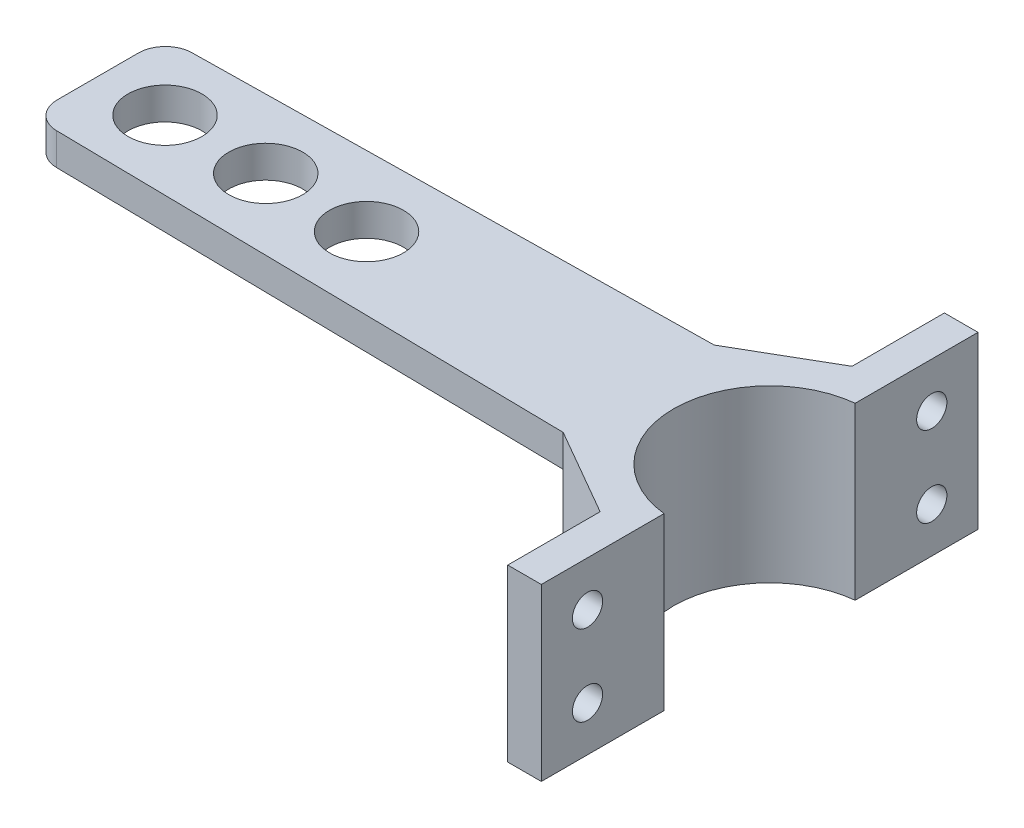
ISO-10303-21;
HEADER;
FILE_DESCRIPTION(('STEP AP214'),'2;1');
FILE_NAME('part.step','',(''),(''),'','','');
FILE_SCHEMA(('AUTOMOTIVE_DESIGN { 1 0 10303 214 1 1 1 1 }'));
ENDSEC;
DATA;
#1=APPLICATION_CONTEXT('core data for automotive mechanical design processes');
#2=APPLICATION_PROTOCOL_DEFINITION('international standard','automotive_design',2000,#1);
#3=PRODUCT_CONTEXT('',#1,'mechanical');
#4=PRODUCT('Part','Part','',(#3));
#5=PRODUCT_RELATED_PRODUCT_CATEGORY('part','',(#4));
#6=PRODUCT_DEFINITION_FORMATION('','',#4);
#7=PRODUCT_DEFINITION_CONTEXT('part definition',#1,'design');
#8=PRODUCT_DEFINITION('design','',#6,#7);
#9=PRODUCT_DEFINITION_SHAPE('','',#8);
#10=(LENGTH_UNIT() NAMED_UNIT(*) SI_UNIT(.MILLI.,.METRE.));
#11=(NAMED_UNIT(*) PLANE_ANGLE_UNIT() SI_UNIT($,.RADIAN.));
#12=(NAMED_UNIT(*) SI_UNIT($,.STERADIAN.) SOLID_ANGLE_UNIT());
#13=UNCERTAINTY_MEASURE_WITH_UNIT(LENGTH_MEASURE(1.E-05),#10,'distance_accuracy_value','');
#14=(GEOMETRIC_REPRESENTATION_CONTEXT(3) GLOBAL_UNCERTAINTY_ASSIGNED_CONTEXT((#13)) GLOBAL_UNIT_ASSIGNED_CONTEXT((#10,
#11,#12)) REPRESENTATION_CONTEXT('',''));
#15=CARTESIAN_POINT('',(0.,0.,0.));
#16=DIRECTION('',(0.,0.,1.));
#17=DIRECTION('',(1.,0.,0.));
#18=AXIS2_PLACEMENT_3D('',#15,#16,#17);
#19=CARTESIAN_POINT('',(-19.4855651735435,25.4,0.0158072005749479));
#20=DIRECTION('',(0.999999670956206,0.,-0.000811225911740494));
#21=DIRECTION('',(-0.000811225911740494,0.,-0.999999670956206));
#22=AXIS2_PLACEMENT_3D('',#19,#20,#21);
#23=PLANE('',#22);
#24=DIRECTION('',(0.000811225911740494,0.,0.999999670956206));
#25=VECTOR('',#24,1.);
#26=CARTESIAN_POINT('',(-19.4855651735435,20.6375,0.0158072005749479));
#27=LINE('',#26,#25);
#28=CARTESIAN_POINT('',(-19.4946914650506,20.6375,-11.2341890976824));
#29=VERTEX_POINT('',#28);
#30=CARTESIAN_POINT('',(-19.4764388820364,20.6375,11.2658034988322));
#31=VERTEX_POINT('',#30);
#32=EDGE_CURVE('E153',#29,#31,#27,.T.);
#33=ORIENTED_EDGE('',*,*,#32,.F.);
#34=DIRECTION('',(0.,-1.,0.));
#35=VECTOR('',#34,1.);
#36=CARTESIAN_POINT('',(-19.4946914650506,25.4,-11.2341890976824));
#37=LINE('',#36,#35);
#38=CARTESIAN_POINT('',(-19.4946914650506,0.,-11.2341890976824));
#39=VERTEX_POINT('',#38);
#40=EDGE_CURVE('E165',#29,#39,#37,.T.);
#41=ORIENTED_EDGE('',*,*,#40,.T.);
#42=DIRECTION('',(0.000811225911740494,0.,0.999999670956206));
#43=VECTOR('',#42,1.);
#44=CARTESIAN_POINT('',(-19.4855651735435,0.,0.0158072005749479));
#45=LINE('',#44,#43);
#46=CARTESIAN_POINT('',(-19.4764388820364,0.,11.2658034988323));
#47=VERTEX_POINT('',#46);
#48=EDGE_CURVE('E170',#39,#47,#45,.T.);
#49=ORIENTED_EDGE('',*,*,#48,.T.);
#50=DIRECTION('',(0.,-1.,0.));
#51=VECTOR('',#50,1.);
#52=CARTESIAN_POINT('',(-19.4764388820364,25.4,11.2658034988323));
#53=LINE('',#52,#51);
#54=EDGE_CURVE('E161',#31,#47,#53,.T.);
#55=ORIENTED_EDGE('',*,*,#54,.F.);
#56=EDGE_LOOP('',(#33,#41,#49,#55));
#57=FACE_BOUND('',#56,.T.);
#58=ADVANCED_FACE('F39',(#57),#23,.F.);
#59=CARTESIAN_POINT('',(0.,25.4,-32.5035075145393));
#60=DIRECTION('',(0.,0.,1.));
#61=DIRECTION('',(1.,0.,0.));
#62=AXIS2_PLACEMENT_3D('',#59,#60,#61);
#63=PLANE('',#62);
#64=DIRECTION('',(-1.,0.,0.));
#65=VECTOR('',#64,1.);
#66=CARTESIAN_POINT('',(0.,0.,-32.5035075145393));
#67=LINE('',#66,#65);
#68=CARTESIAN_POINT('',(-1.5,0.,-32.5035075145393));
#69=VERTEX_POINT('',#68);
#70=CARTESIAN_POINT('',(-6.5,0.,-32.5035075145393));
#71=VERTEX_POINT('',#70);
#72=EDGE_CURVE('E213',#69,#71,#67,.T.);
#73=ORIENTED_EDGE('',*,*,#72,.T.);
#74=DIRECTION('',(0.,-1.,0.));
#75=VECTOR('',#74,1.);
#76=CARTESIAN_POINT('',(-6.5,25.4,-32.5035075145393));
#77=LINE('',#76,#75);
#78=CARTESIAN_POINT('',(-6.5,25.4,-32.5035075145393));
#79=VERTEX_POINT('',#78);
#80=EDGE_CURVE('E286',#79,#71,#77,.T.);
#81=ORIENTED_EDGE('',*,*,#80,.F.);
#82=DIRECTION('',(-1.,0.,0.));
#83=VECTOR('',#82,1.);
#84=CARTESIAN_POINT('',(0.,25.4,-32.5035075145393));
#85=LINE('',#84,#83);
#86=CARTESIAN_POINT('',(-1.5,25.4,-32.5035075145393));
#87=VERTEX_POINT('',#86);
#88=EDGE_CURVE('E222',#87,#79,#85,.T.);
#89=ORIENTED_EDGE('',*,*,#88,.F.);
#90=DIRECTION('',(0.,-1.,0.));
#91=VECTOR('',#90,1.);
#92=CARTESIAN_POINT('',(-1.5,25.4,-32.5035075145393));
#93=LINE('',#92,#91);
#94=EDGE_CURVE('E245',#87,#69,#93,.T.);
#95=ORIENTED_EDGE('',*,*,#94,.T.);
#96=EDGE_LOOP('',(#73,#81,#89,#95));
#97=FACE_BOUND('',#96,.T.);
#98=ADVANCED_FACE('F349',(#97),#63,.F.);
#99=CARTESIAN_POINT('',(-6.5,25.4,0.));
#100=DIRECTION('',(1.,0.,0.));
#101=DIRECTION('',(0.,0.,-1.));
#102=AXIS2_PLACEMENT_3D('',#99,#100,#101);
#103=PLANE('',#102);
#104=CARTESIAN_POINT('',(-6.5,18.7,-25.620108633731));
#105=DIRECTION('',(1.,0.,0.));
#106=DIRECTION('',(0.,0.,-1.));
#107=AXIS2_PLACEMENT_3D('',#104,#105,#106);
#108=CIRCLE('',#107,2.25);
#109=CARTESIAN_POINT('',(-6.5,18.7,-27.870108633731));
#110=VERTEX_POINT('',#109);
#111=EDGE_CURVE('E202',#110,#110,#108,.T.);
#112=ORIENTED_EDGE('',*,*,#111,.T.);
#113=EDGE_LOOP('',(#112));
#114=FACE_BOUND('',#113,.T.);
#115=CARTESIAN_POINT('',(-6.5,6.7,-25.620108633731));
#116=DIRECTION('',(1.,0.,0.));
#117=DIRECTION('',(0.,0.,-1.));
#118=AXIS2_PLACEMENT_3D('',#115,#116,#117);
#119=CIRCLE('',#118,2.25);
#120=CARTESIAN_POINT('',(-6.5,6.7,-27.870108633731));
#121=VERTEX_POINT('',#120);
#122=EDGE_CURVE('E176',#121,#121,#119,.T.);
#123=ORIENTED_EDGE('',*,*,#122,.T.);
#124=EDGE_LOOP('',(#123));
#125=FACE_BOUND('',#124,.T.);
#126=DIRECTION('',(0.,0.,1.));
#127=VECTOR('',#126,1.);
#128=CARTESIAN_POINT('',(-6.5,0.,0.));
#129=LINE('',#128,#127);
#130=CARTESIAN_POINT('',(-6.5,0.,-18.7507398110798));
#131=VERTEX_POINT('',#130);
#132=EDGE_CURVE('E248',#71,#131,#129,.T.);
#133=ORIENTED_EDGE('',*,*,#132,.T.);
#134=DIRECTION('',(0.,-1.,0.));
#135=VECTOR('',#134,1.);
#136=CARTESIAN_POINT('',(-6.5,25.4,-18.7507398110798));
#137=LINE('',#136,#135);
#138=CARTESIAN_POINT('',(-6.5,25.4,-18.7507398110798));
#139=VERTEX_POINT('',#138);
#140=EDGE_CURVE('E283',#139,#131,#137,.T.);
#141=ORIENTED_EDGE('',*,*,#140,.F.);
#142=DIRECTION('',(0.,0.,1.));
#143=VECTOR('',#142,1.);
#144=CARTESIAN_POINT('',(-6.5,25.4,0.));
#145=LINE('',#144,#143);
#146=EDGE_CURVE('E225',#79,#139,#145,.T.);
#147=ORIENTED_EDGE('',*,*,#146,.F.);
#148=ORIENTED_EDGE('',*,*,#80,.T.);
#149=EDGE_LOOP('',(#133,#141,#147,#148));
#150=FACE_BOUND('',#149,.T.);
#151=ADVANCED_FACE('F351',(#114,#125,#150),#103,.F.);
#152=CARTESIAN_POINT('',(-9.75647202403235,25.4,-16.8670908470985));
#153=DIRECTION('',(0.500702377725878,0.,0.865619505868284));
#154=DIRECTION('',(0.865619505868284,0.,-0.500702377725878));
#155=AXIS2_PLACEMENT_3D('',#152,#153,#154);
#156=PLANE('',#155);
#157=DIRECTION('',(-0.865619505868284,0.,0.500702377725878));
#158=VECTOR('',#157,1.);
#159=CARTESIAN_POINT('',(-9.75647202403235,0.,-16.8670908470985));
#160=LINE('',#159,#158);
#161=EDGE_CURVE('E250',#131,#39,#160,.T.);
#162=ORIENTED_EDGE('',*,*,#161,.T.);
#163=ORIENTED_EDGE('',*,*,#40,.F.);
#164=CARTESIAN_POINT('',(-19.4946914650506,25.4,-11.2341890976824));
#165=VERTEX_POINT('',#164);
#166=EDGE_CURVE('E280',#165,#29,#37,.T.);
#167=ORIENTED_EDGE('',*,*,#166,.F.);
#168=DIRECTION('',(-0.865619505868284,0.,0.500702377725878));
#169=VECTOR('',#168,1.);
#170=CARTESIAN_POINT('',(-9.75647202403235,25.4,-16.8670908470985));
#171=LINE('',#170,#169);
#172=EDGE_CURVE('E228',#139,#165,#171,.T.);
#173=ORIENTED_EDGE('',*,*,#172,.F.);
#174=ORIENTED_EDGE('',*,*,#140,.T.);
#175=EDGE_LOOP('',(#162,#163,#167,#173,#174));
#176=FACE_BOUND('',#175,.T.);
#177=ADVANCED_FACE('F320',(#176),#156,.F.);
#178=CARTESIAN_POINT('',(-9.72909314951112,25.4,16.8828980476734));
#179=DIRECTION('',(0.499297293230328,0.,-0.866430731780024));
#180=DIRECTION('',(-0.866430731780024,0.,-0.499297293230328));
#181=AXIS2_PLACEMENT_3D('',#178,#179,#180);
#182=PLANE('',#181);
#183=DIRECTION('',(0.866430731780024,0.,0.499297293230328));
#184=VECTOR('',#183,1.);
#185=CARTESIAN_POINT('',(-9.72909314951112,0.,16.8828980476734));
#186=LINE('',#185,#184);
#187=CARTESIAN_POINT('',(-6.5,0.,18.7437247820013));
#188=VERTEX_POINT('',#187);
#189=EDGE_CURVE('E254',#47,#188,#186,.T.);
#190=ORIENTED_EDGE('',*,*,#189,.T.);
#191=DIRECTION('',(0.,-1.,0.));
#192=VECTOR('',#191,1.);
#193=CARTESIAN_POINT('',(-6.5,25.4,18.7437247820013));
#194=LINE('',#193,#192);
#195=CARTESIAN_POINT('',(-6.5,25.4,18.7437247820013));
#196=VERTEX_POINT('',#195);
#197=EDGE_CURVE('E172',#196,#188,#194,.T.);
#198=ORIENTED_EDGE('',*,*,#197,.F.);
#199=DIRECTION('',(0.866430731780024,0.,0.499297293230328));
#200=VECTOR('',#199,1.);
#201=CARTESIAN_POINT('',(-9.72909314951112,25.4,16.8828980476734));
#202=LINE('',#201,#200);
#203=CARTESIAN_POINT('',(-19.4764388820364,25.4,11.2658034988323));
#204=VERTEX_POINT('',#203);
#205=EDGE_CURVE('E164',#204,#196,#202,.T.);
#206=ORIENTED_EDGE('',*,*,#205,.F.);
#207=EDGE_CURVE('E150',#204,#31,#53,.T.);
#208=ORIENTED_EDGE('',*,*,#207,.T.);
#209=ORIENTED_EDGE('',*,*,#54,.T.);
#210=EDGE_LOOP('',(#190,#198,#206,#208,#209));
#211=FACE_BOUND('',#210,.T.);
#212=ADVANCED_FACE('F160',(#211),#182,.F.);
#213=CARTESIAN_POINT('',(-6.5,25.4,0.));
#214=DIRECTION('',(-1.,0.,0.));
#215=DIRECTION('',(0.,0.,1.));
#216=AXIS2_PLACEMENT_3D('',#213,#214,#215);
#217=PLANE('',#216);
#218=CARTESIAN_POINT('',(-6.5,18.7,25.620108633731));
#219=DIRECTION('',(-1.,0.,0.));
#220=DIRECTION('',(0.,0.,1.));
#221=AXIS2_PLACEMENT_3D('',#218,#219,#220);
#222=CIRCLE('',#221,2.25);
#223=CARTESIAN_POINT('',(-6.5,18.7,27.870108633731));
#224=VERTEX_POINT('',#223);
#225=EDGE_CURVE('E214',#224,#224,#222,.T.);
#226=ORIENTED_EDGE('',*,*,#225,.F.);
#227=EDGE_LOOP('',(#226));
#228=FACE_BOUND('',#227,.T.);
#229=CARTESIAN_POINT('',(-6.5,6.7,25.620108633731));
#230=DIRECTION('',(-1.,0.,0.));
#231=DIRECTION('',(0.,0.,1.));
#232=AXIS2_PLACEMENT_3D('',#229,#230,#231);
#233=CIRCLE('',#232,2.25);
#234=CARTESIAN_POINT('',(-6.5,6.7,27.870108633731));
#235=VERTEX_POINT('',#234);
#236=EDGE_CURVE('E217',#235,#235,#233,.T.);
#237=ORIENTED_EDGE('',*,*,#236,.F.);
#238=EDGE_LOOP('',(#237));
#239=FACE_BOUND('',#238,.T.);
#240=DIRECTION('',(0.,0.,-1.));
#241=VECTOR('',#240,1.);
#242=CARTESIAN_POINT('',(-6.5,0.,0.));
#243=LINE('',#242,#241);
#244=CARTESIAN_POINT('',(-6.5,0.,32.4964924854607));
#245=VERTEX_POINT('',#244);
#246=EDGE_CURVE('E256',#245,#188,#243,.T.);
#247=ORIENTED_EDGE('',*,*,#246,.F.);
#248=DIRECTION('',(0.,-1.,0.));
#249=VECTOR('',#248,1.);
#250=CARTESIAN_POINT('',(-6.5,25.4,32.4964924854607));
#251=LINE('',#250,#249);
#252=CARTESIAN_POINT('',(-6.5,25.4,32.4964924854607));
#253=VERTEX_POINT('',#252);
#254=EDGE_CURVE('E277',#253,#245,#251,.T.);
#255=ORIENTED_EDGE('',*,*,#254,.F.);
#256=DIRECTION('',(0.,0.,-1.));
#257=VECTOR('',#256,1.);
#258=CARTESIAN_POINT('',(-6.5,25.4,0.));
#259=LINE('',#258,#257);
#260=EDGE_CURVE('E231',#253,#196,#259,.T.);
#261=ORIENTED_EDGE('',*,*,#260,.T.);
#262=ORIENTED_EDGE('',*,*,#197,.T.);
#263=EDGE_LOOP('',(#247,#255,#261,#262));
#264=FACE_BOUND('',#263,.T.);
#265=ADVANCED_FACE('F328',(#228,#239,#264),#217,.T.);
#266=CARTESIAN_POINT('',(0.,25.4,32.4964924854607));
#267=DIRECTION('',(0.,0.,1.));
#268=DIRECTION('',(1.,0.,0.));
#269=AXIS2_PLACEMENT_3D('',#266,#267,#268);
#270=PLANE('',#269);
#271=DIRECTION('',(-1.,0.,0.));
#272=VECTOR('',#271,1.);
#273=CARTESIAN_POINT('',(0.,0.,32.4964924854607));
#274=LINE('',#273,#272);
#275=CARTESIAN_POINT('',(-1.5,0.,32.4964924854607));
#276=VERTEX_POINT('',#275);
#277=EDGE_CURVE('E259',#276,#245,#274,.T.);
#278=ORIENTED_EDGE('',*,*,#277,.F.);
#279=DIRECTION('',(0.,-1.,0.));
#280=VECTOR('',#279,1.);
#281=CARTESIAN_POINT('',(-1.5,25.4,32.4964924854607));
#282=LINE('',#281,#280);
#283=CARTESIAN_POINT('',(-1.5,25.4,32.4964924854607));
#284=VERTEX_POINT('',#283);
#285=EDGE_CURVE('E275',#284,#276,#282,.T.);
#286=ORIENTED_EDGE('',*,*,#285,.F.);
#287=DIRECTION('',(-1.,0.,0.));
#288=VECTOR('',#287,1.);
#289=CARTESIAN_POINT('',(0.,25.4,32.4964924854607));
#290=LINE('',#289,#288);
#291=EDGE_CURVE('E234',#284,#253,#290,.T.);
#292=ORIENTED_EDGE('',*,*,#291,.T.);
#293=ORIENTED_EDGE('',*,*,#254,.T.);
#294=EDGE_LOOP('',(#278,#286,#292,#293));
#295=FACE_BOUND('',#294,.T.);
#296=ADVANCED_FACE('F333',(#295),#270,.T.);
#297=CARTESIAN_POINT('',(-1.5,25.4,0.));
#298=DIRECTION('',(1.,0.,0.));
#299=DIRECTION('',(0.,0.,-1.));
#300=AXIS2_PLACEMENT_3D('',#297,#298,#299);
#301=PLANE('',#300);
#302=CARTESIAN_POINT('',(-1.5,18.7,25.620108633731));
#303=DIRECTION('',(-1.,0.,0.));
#304=DIRECTION('',(0.,0.,1.));
#305=AXIS2_PLACEMENT_3D('',#302,#303,#304);
#306=CIRCLE('',#305,2.25);
#307=CARTESIAN_POINT('',(-1.5,18.7,27.870108633731));
#308=VERTEX_POINT('',#307);
#309=EDGE_CURVE('E210',#308,#308,#306,.T.);
#310=ORIENTED_EDGE('',*,*,#309,.T.);
#311=EDGE_LOOP('',(#310));
#312=FACE_BOUND('',#311,.T.);
#313=CARTESIAN_POINT('',(-1.5,6.7,25.620108633731));
#314=DIRECTION('',(-1.,0.,0.));
#315=DIRECTION('',(0.,0.,1.));
#316=AXIS2_PLACEMENT_3D('',#313,#314,#315);
#317=CIRCLE('',#316,2.25);
#318=CARTESIAN_POINT('',(-1.5,6.7,27.870108633731));
#319=VERTEX_POINT('',#318);
#320=EDGE_CURVE('E201',#319,#319,#317,.T.);
#321=ORIENTED_EDGE('',*,*,#320,.T.);
#322=EDGE_LOOP('',(#321));
#323=FACE_BOUND('',#322,.T.);
#324=DIRECTION('',(0.,0.,1.));
#325=VECTOR('',#324,1.);
#326=CARTESIAN_POINT('',(-1.5,0.,0.));
#327=LINE('',#326,#325);
#328=CARTESIAN_POINT('',(-1.5,0.,14.2211110677049));
#329=VERTEX_POINT('',#328);
#330=EDGE_CURVE('E262',#329,#276,#327,.T.);
#331=ORIENTED_EDGE('',*,*,#330,.F.);
#332=DIRECTION('',(0.,-1.,0.));
#333=VECTOR('',#332,1.);
#334=CARTESIAN_POINT('',(-1.5,25.4,14.2211110677049));
#335=LINE('',#334,#333);
#336=CARTESIAN_POINT('',(-1.5,25.4,14.2211110677049));
#337=VERTEX_POINT('',#336);
#338=EDGE_CURVE('E273',#337,#329,#335,.T.);
#339=ORIENTED_EDGE('',*,*,#338,.F.);
#340=DIRECTION('',(0.,0.,1.));
#341=VECTOR('',#340,1.);
#342=CARTESIAN_POINT('',(-1.5,25.4,0.));
#343=LINE('',#342,#341);
#344=EDGE_CURVE('E237',#337,#284,#343,.T.);
#345=ORIENTED_EDGE('',*,*,#344,.T.);
#346=ORIENTED_EDGE('',*,*,#285,.T.);
#347=EDGE_LOOP('',(#331,#339,#345,#346));
#348=FACE_BOUND('',#347,.T.);
#349=ADVANCED_FACE('F336',(#312,#323,#348),#301,.T.);
#350=CARTESIAN_POINT('',(0.,25.4,0.));
#351=DIRECTION('',(0.,-1.,0.));
#352=DIRECTION('',(0.,0.,-1.));
#353=AXIS2_PLACEMENT_3D('',#350,#351,#352);
#354=CYLINDRICAL_SURFACE('',#353,14.3);
#355=CARTESIAN_POINT('',(0.,0.,0.));
#356=DIRECTION('',(0.,1.,0.));
#357=DIRECTION('',(0.,0.,1.));
#358=AXIS2_PLACEMENT_3D('',#355,#356,#357);
#359=CIRCLE('',#358,14.3);
#360=CARTESIAN_POINT('',(-1.5,0.,-14.2211110677049));
#361=VERTEX_POINT('',#360);
#362=EDGE_CURVE('E265',#361,#329,#359,.T.);
#363=ORIENTED_EDGE('',*,*,#362,.F.);
#364=DIRECTION('',(0.,-1.,0.));
#365=VECTOR('',#364,1.);
#366=CARTESIAN_POINT('',(-1.5,25.4,-14.2211110677049));
#367=LINE('',#366,#365);
#368=CARTESIAN_POINT('',(-1.5,25.4,-14.2211110677049));
#369=VERTEX_POINT('',#368);
#370=EDGE_CURVE('E271',#369,#361,#367,.T.);
#371=ORIENTED_EDGE('',*,*,#370,.F.);
#372=CARTESIAN_POINT('',(0.,25.4,0.));
#373=DIRECTION('',(0.,1.,0.));
#374=DIRECTION('',(0.,0.,1.));
#375=AXIS2_PLACEMENT_3D('',#372,#373,#374);
#376=CIRCLE('',#375,14.3);
#377=EDGE_CURVE('E240',#369,#337,#376,.T.);
#378=ORIENTED_EDGE('',*,*,#377,.T.);
#379=ORIENTED_EDGE('',*,*,#338,.T.);
#380=EDGE_LOOP('',(#363,#371,#378,#379));
#381=FACE_BOUND('',#380,.T.);
#382=ADVANCED_FACE('F340',(#381),#354,.F.);
#383=CARTESIAN_POINT('',(-1.5,25.4,0.));
#384=DIRECTION('',(-1.,0.,0.));
#385=DIRECTION('',(0.,0.,1.));
#386=AXIS2_PLACEMENT_3D('',#383,#384,#385);
#387=PLANE('',#386);
#388=CARTESIAN_POINT('',(-1.5,18.7,-25.620108633731));
#389=DIRECTION('',(1.,0.,0.));
#390=DIRECTION('',(0.,0.,-1.));
#391=AXIS2_PLACEMENT_3D('',#388,#389,#390);
#392=CIRCLE('',#391,2.25);
#393=CARTESIAN_POINT('',(-1.5,18.7,-27.870108633731));
#394=VERTEX_POINT('',#393);
#395=EDGE_CURVE('E198',#394,#394,#392,.T.);
#396=ORIENTED_EDGE('',*,*,#395,.F.);
#397=EDGE_LOOP('',(#396));
#398=FACE_BOUND('',#397,.T.);
#399=CARTESIAN_POINT('',(-1.5,6.7,-25.620108633731));
#400=DIRECTION('',(1.,0.,0.));
#401=DIRECTION('',(0.,0.,-1.));
#402=AXIS2_PLACEMENT_3D('',#399,#400,#401);
#403=CIRCLE('',#402,2.25);
#404=CARTESIAN_POINT('',(-1.5,6.7,-27.870108633731));
#405=VERTEX_POINT('',#404);
#406=EDGE_CURVE('E205',#405,#405,#403,.T.);
#407=ORIENTED_EDGE('',*,*,#406,.F.);
#408=EDGE_LOOP('',(#407));
#409=FACE_BOUND('',#408,.T.);
#410=DIRECTION('',(0.,0.,-1.));
#411=VECTOR('',#410,1.);
#412=CARTESIAN_POINT('',(-1.5,0.,0.));
#413=LINE('',#412,#411);
#414=EDGE_CURVE('E226',#361,#69,#413,.T.);
#415=ORIENTED_EDGE('',*,*,#414,.T.);
#416=ORIENTED_EDGE('',*,*,#94,.F.);
#417=DIRECTION('',(0.,0.,-1.));
#418=VECTOR('',#417,1.);
#419=CARTESIAN_POINT('',(-1.5,25.4,0.));
#420=LINE('',#419,#418);
#421=EDGE_CURVE('E243',#369,#87,#420,.T.);
#422=ORIENTED_EDGE('',*,*,#421,.F.);
#423=ORIENTED_EDGE('',*,*,#370,.T.);
#424=EDGE_LOOP('',(#415,#416,#422,#423));
#425=FACE_BOUND('',#424,.T.);
#426=ADVANCED_FACE('F345',(#398,#409,#425),#387,.F.);
#427=CARTESIAN_POINT('',(0.,25.4,0.));
#428=DIRECTION('',(0.,1.,0.));
#429=DIRECTION('',(0.,0.,1.));
#430=AXIS2_PLACEMENT_3D('',#427,#428,#429);
#431=PLANE('',#430);
#432=DIRECTION('',(0.,0.,1.));
#433=VECTOR('',#432,1.);
#434=CARTESIAN_POINT('',(-100.,25.4,0.));
#435=LINE('',#434,#433);
#436=CARTESIAN_POINT('',(-100.,25.4,-6.04581818210474));
#437=VERTEX_POINT('',#436);
#438=CARTESIAN_POINT('',(-100.,25.4,6.0774187236442));
#439=VERTEX_POINT('',#438);
#440=EDGE_CURVE('E189',#437,#439,#435,.T.);
#441=ORIENTED_EDGE('',*,*,#440,.T.);
#442=CARTESIAN_POINT('',(-96.,25.4,6.0774187236442));
#443=DIRECTION('',(0.,1.,0.));
#444=DIRECTION('',(0.,0.,1.));
#445=AXIS2_PLACEMENT_3D('',#442,#443,#444);
#446=CIRCLE('',#445,4.);
#447=CARTESIAN_POINT('',(-96.0620859633805,25.4,10.0769368612642));
#448=VERTEX_POINT('',#447);
#449=EDGE_CURVE('E296',#439,#448,#446,.T.);
#450=ORIENTED_EDGE('',*,*,#449,.T.);
#451=DIRECTION('',(0.999879534404993,0.,0.0155214908451269));
#452=VECTOR('',#451,1.);
#453=CARTESIAN_POINT('',(-0.179533199963123,25.4,11.5653563295258));
#454=LINE('',#453,#452);
#455=EDGE_CURVE('E192',#448,#204,#454,.T.);
#456=ORIENTED_EDGE('',*,*,#455,.T.);
#457=ORIENTED_EDGE('',*,*,#205,.T.);
#458=ORIENTED_EDGE('',*,*,#260,.F.);
#459=ORIENTED_EDGE('',*,*,#291,.F.);
#460=ORIENTED_EDGE('',*,*,#344,.F.);
#461=ORIENTED_EDGE('',*,*,#377,.F.);
#462=ORIENTED_EDGE('',*,*,#421,.T.);
#463=ORIENTED_EDGE('',*,*,#88,.T.);
#464=ORIENTED_EDGE('',*,*,#146,.T.);
#465=ORIENTED_EDGE('',*,*,#172,.T.);
#466=DIRECTION('',(-0.999879479783501,0.,0.0155250091103028));
#467=VECTOR('',#466,1.);
#468=CARTESIAN_POINT('',(-0.179088593759497,25.4,-11.5341001535755));
#469=LINE('',#468,#467);
#470=CARTESIAN_POINT('',(-96.0621000364412,25.4,-10.0453361012387));
#471=VERTEX_POINT('',#470);
#472=EDGE_CURVE('E194',#165,#471,#469,.T.);
#473=ORIENTED_EDGE('',*,*,#472,.T.);
#474=CARTESIAN_POINT('',(-96.,25.4,-6.04581818210474));
#475=DIRECTION('',(0.,1.,0.));
#476=DIRECTION('',(0.,0.,1.));
#477=AXIS2_PLACEMENT_3D('',#474,#475,#476);
#478=CIRCLE('',#477,4.);
#479=EDGE_CURVE('E294',#471,#437,#478,.T.);
#480=ORIENTED_EDGE('',*,*,#479,.T.);
#481=EDGE_LOOP('',(#441,#450,#456,#457,#458,#459,#460,#461,#462,#463,#464,#465,#473,#480));
#482=FACE_BOUND('',#481,.T.);
#483=CARTESIAN_POINT('',(-60.,25.4,0.0158072005749426));
#484=DIRECTION('',(0.,1.,0.));
#485=DIRECTION('',(0.,0.,1.));
#486=AXIS2_PLACEMENT_3D('',#483,#484,#485);
#487=CIRCLE('',#486,5.5);
#488=CARTESIAN_POINT('',(-60.,25.4,5.51580720057494));
#489=VERTEX_POINT('',#488);
#490=EDGE_CURVE('E180',#489,#489,#487,.T.);
#491=ORIENTED_EDGE('',*,*,#490,.F.);
#492=EDGE_LOOP('',(#491));
#493=FACE_BOUND('',#492,.T.);
#494=CARTESIAN_POINT('',(-75.,25.4,0.0158072005749426));
#495=DIRECTION('',(0.,1.,0.));
#496=DIRECTION('',(0.,0.,1.));
#497=AXIS2_PLACEMENT_3D('',#494,#495,#496);
#498=CIRCLE('',#497,5.5);
#499=CARTESIAN_POINT('',(-75.,25.4,5.51580720057495));
#500=VERTEX_POINT('',#499);
#501=EDGE_CURVE('E183',#500,#500,#498,.T.);
#502=ORIENTED_EDGE('',*,*,#501,.F.);
#503=EDGE_LOOP('',(#502));
#504=FACE_BOUND('',#503,.T.);
#505=CARTESIAN_POINT('',(-90.,25.4,0.0158072005749426));
#506=DIRECTION('',(0.,1.,0.));
#507=DIRECTION('',(0.,0.,1.));
#508=AXIS2_PLACEMENT_3D('',#505,#506,#507);
#509=CIRCLE('',#508,5.5);
#510=CARTESIAN_POINT('',(-90.,25.4,5.51580720057495));
#511=VERTEX_POINT('',#510);
#512=EDGE_CURVE('E186',#511,#511,#509,.T.);
#513=ORIENTED_EDGE('',*,*,#512,.F.);
#514=EDGE_LOOP('',(#513));
#515=FACE_BOUND('',#514,.T.);
#516=ADVANCED_FACE('F309',(#482,#493,#504,#515),#431,.T.);
#517=CARTESIAN_POINT('',(0.,0.,0.));
#518=DIRECTION('',(0.,1.,0.));
#519=DIRECTION('',(0.,0.,1.));
#520=AXIS2_PLACEMENT_3D('',#517,#518,#519);
#521=PLANE('',#520);
#522=ORIENTED_EDGE('',*,*,#72,.F.);
#523=ORIENTED_EDGE('',*,*,#414,.F.);
#524=ORIENTED_EDGE('',*,*,#362,.T.);
#525=ORIENTED_EDGE('',*,*,#330,.T.);
#526=ORIENTED_EDGE('',*,*,#277,.T.);
#527=ORIENTED_EDGE('',*,*,#246,.T.);
#528=ORIENTED_EDGE('',*,*,#189,.F.);
#529=ORIENTED_EDGE('',*,*,#48,.F.);
#530=ORIENTED_EDGE('',*,*,#161,.F.);
#531=ORIENTED_EDGE('',*,*,#132,.F.);
#532=EDGE_LOOP('',(#522,#523,#524,#525,#526,#527,#528,#529,#530,#531));
#533=FACE_BOUND('',#532,.T.);
#534=ADVANCED_FACE('F324',(#533),#521,.F.);
#535=CARTESIAN_POINT('',(-1.5,6.7,25.620108633731));
#536=DIRECTION('',(-1.,0.,0.));
#537=DIRECTION('',(0.,0.,1.));
#538=AXIS2_PLACEMENT_3D('',#535,#536,#537);
#539=CYLINDRICAL_SURFACE('',#538,2.25);
#540=ORIENTED_EDGE('',*,*,#320,.F.);
#541=EDGE_LOOP('',(#540));
#542=FACE_BOUND('',#541,.T.);
#543=ORIENTED_EDGE('',*,*,#236,.T.);
#544=EDGE_LOOP('',(#543));
#545=FACE_BOUND('',#544,.T.);
#546=ADVANCED_FACE('F386',(#542,#545),#539,.F.);
#547=CARTESIAN_POINT('',(-1.5,18.7,25.620108633731));
#548=DIRECTION('',(-1.,0.,0.));
#549=DIRECTION('',(0.,0.,1.));
#550=AXIS2_PLACEMENT_3D('',#547,#548,#549);
#551=CYLINDRICAL_SURFACE('',#550,2.25);
#552=ORIENTED_EDGE('',*,*,#309,.F.);
#553=EDGE_LOOP('',(#552));
#554=FACE_BOUND('',#553,.T.);
#555=ORIENTED_EDGE('',*,*,#225,.T.);
#556=EDGE_LOOP('',(#555));
#557=FACE_BOUND('',#556,.T.);
#558=ADVANCED_FACE('F391',(#554,#557),#551,.F.);
#559=CARTESIAN_POINT('',(-1.5,6.7,-25.620108633731));
#560=DIRECTION('',(-1.,0.,0.));
#561=DIRECTION('',(0.,0.,1.));
#562=AXIS2_PLACEMENT_3D('',#559,#560,#561);
#563=CYLINDRICAL_SURFACE('',#562,2.25);
#564=ORIENTED_EDGE('',*,*,#406,.T.);
#565=EDGE_LOOP('',(#564));
#566=FACE_BOUND('',#565,.T.);
#567=ORIENTED_EDGE('',*,*,#122,.F.);
#568=EDGE_LOOP('',(#567));
#569=FACE_BOUND('',#568,.T.);
#570=ADVANCED_FACE('F395',(#566,#569),#563,.F.);
#571=CARTESIAN_POINT('',(-1.5,18.7,-25.620108633731));
#572=DIRECTION('',(-1.,0.,0.));
#573=DIRECTION('',(0.,0.,1.));
#574=AXIS2_PLACEMENT_3D('',#571,#572,#573);
#575=CYLINDRICAL_SURFACE('',#574,2.25);
#576=ORIENTED_EDGE('',*,*,#395,.T.);
#577=EDGE_LOOP('',(#576));
#578=FACE_BOUND('',#577,.T.);
#579=ORIENTED_EDGE('',*,*,#111,.F.);
#580=EDGE_LOOP('',(#579));
#581=FACE_BOUND('',#580,.T.);
#582=ADVANCED_FACE('F399',(#578,#581),#575,.F.);
#583=CARTESIAN_POINT('',(-100.,20.6375,0.));
#584=DIRECTION('',(-1.,0.,0.));
#585=DIRECTION('',(0.,0.,1.));
#586=AXIS2_PLACEMENT_3D('',#583,#584,#585);
#587=PLANE('',#586);
#588=DIRECTION('',(0.,0.,1.));
#589=VECTOR('',#588,1.);
#590=CARTESIAN_POINT('',(-100.,20.6375,0.));
#591=LINE('',#590,#589);
#592=CARTESIAN_POINT('',(-100.,20.6375,-6.04581818210474));
#593=VERTEX_POINT('',#592);
#594=CARTESIAN_POINT('',(-100.,20.6375,6.0774187236442));
#595=VERTEX_POINT('',#594);
#596=EDGE_CURVE('E154',#593,#595,#591,.T.);
#597=ORIENTED_EDGE('',*,*,#596,.T.);
#598=DIRECTION('',(0.,1.,0.));
#599=VECTOR('',#598,1.);
#600=CARTESIAN_POINT('',(-100.,20.6375,6.0774187236442));
#601=LINE('',#600,#599);
#602=EDGE_CURVE('E291',#595,#439,#601,.T.);
#603=ORIENTED_EDGE('',*,*,#602,.T.);
#604=ORIENTED_EDGE('',*,*,#440,.F.);
#605=DIRECTION('',(0.,1.,0.));
#606=VECTOR('',#605,1.);
#607=CARTESIAN_POINT('',(-100.,20.6375,-6.04581818210474));
#608=LINE('',#607,#606);
#609=EDGE_CURVE('E289',#437,#593,#608,.F.);
#610=ORIENTED_EDGE('',*,*,#609,.T.);
#611=EDGE_LOOP('',(#597,#603,#604,#610));
#612=FACE_BOUND('',#611,.T.);
#613=ADVANCED_FACE('F303',(#612),#587,.T.);
#614=CARTESIAN_POINT('',(-0.179088593759497,20.6375,-11.5341001535755));
#615=DIRECTION('',(-0.0155250091103028,0.,-0.999879479783501));
#616=DIRECTION('',(-0.999879479783501,0.,0.0155250091103028));
#617=AXIS2_PLACEMENT_3D('',#614,#615,#616);
#618=PLANE('',#617);
#619=DIRECTION('',(-0.999879479783501,0.,0.0155250091103028));
#620=VECTOR('',#619,1.);
#621=CARTESIAN_POINT('',(-0.179088593759497,20.6375,-11.5341001535755));
#622=LINE('',#621,#620);
#623=CARTESIAN_POINT('',(-96.0621000364412,20.6375,-10.0453361012387));
#624=VERTEX_POINT('',#623);
#625=EDGE_CURVE('E174',#29,#624,#622,.T.);
#626=ORIENTED_EDGE('',*,*,#625,.T.);
#627=DIRECTION('',(0.,1.,0.));
#628=VECTOR('',#627,1.);
#629=CARTESIAN_POINT('',(-96.0621000364412,20.6375,-10.0453361012387));
#630=LINE('',#629,#628);
#631=EDGE_CURVE('E11',#624,#471,#630,.T.);
#632=ORIENTED_EDGE('',*,*,#631,.T.);
#633=ORIENTED_EDGE('',*,*,#472,.F.);
#634=ORIENTED_EDGE('',*,*,#166,.T.);
#635=EDGE_LOOP('',(#626,#632,#633,#634));
#636=FACE_BOUND('',#635,.T.);
#637=ADVANCED_FACE('F315',(#636),#618,.T.);
#638=CARTESIAN_POINT('',(-90.,20.6375,0.0158072005749426));
#639=DIRECTION('',(0.,1.,0.));
#640=DIRECTION('',(0.,0.,1.));
#641=AXIS2_PLACEMENT_3D('',#638,#639,#640);
#642=CYLINDRICAL_SURFACE('',#641,5.5);
#643=CARTESIAN_POINT('',(-90.,20.6375,0.0158072005749426));
#644=DIRECTION('',(0.,1.,0.));
#645=DIRECTION('',(0.,0.,1.));
#646=AXIS2_PLACEMENT_3D('',#643,#644,#645);
#647=CIRCLE('',#646,5.5);
#648=CARTESIAN_POINT('',(-90.,20.6375,5.51580720057495));
#649=VERTEX_POINT('',#648);
#650=EDGE_CURVE('E306',#649,#649,#647,.T.);
#651=CARTESIAN_POINT('',(-90.,20.6375,5.51580720057495));
#652=CARTESIAN_POINT('',(-90.,20.687109375,5.51580720057495));
#653=CARTESIAN_POINT('',(-90.,20.73671875,5.51580720057495));
#654=CARTESIAN_POINT('',(-90.,20.8359375,5.51580720057495));
#655=CARTESIAN_POINT('',(-90.,20.885546875,5.51580720057495));
#656=CARTESIAN_POINT('',(-90.,20.984765625,5.51580720057495));
#657=CARTESIAN_POINT('',(-90.,21.034375,5.51580720057495));
#658=CARTESIAN_POINT('',(-90.,21.13359375,5.51580720057495));
#659=CARTESIAN_POINT('',(-90.,21.183203125,5.51580720057495));
#660=CARTESIAN_POINT('',(-90.,21.282421875,5.51580720057495));
#661=CARTESIAN_POINT('',(-90.,21.33203125,5.51580720057495));
#662=CARTESIAN_POINT('',(-90.,21.43125,5.51580720057495));
#663=CARTESIAN_POINT('',(-90.,21.480859375,5.51580720057495));
#664=CARTESIAN_POINT('',(-90.,21.580078125,5.51580720057495));
#665=CARTESIAN_POINT('',(-90.,21.6296875,5.51580720057495));
#666=CARTESIAN_POINT('',(-90.,21.72890625,5.51580720057495));
#667=CARTESIAN_POINT('',(-90.,21.778515625,5.51580720057495));
#668=CARTESIAN_POINT('',(-90.,21.877734375,5.51580720057495));
#669=CARTESIAN_POINT('',(-90.,21.92734375,5.51580720057495));
#670=CARTESIAN_POINT('',(-90.,22.0265625,5.51580720057495));
#671=CARTESIAN_POINT('',(-90.,22.076171875,5.51580720057495));
#672=CARTESIAN_POINT('',(-90.,22.175390625,5.51580720057495));
#673=CARTESIAN_POINT('',(-90.,22.225,5.51580720057495));
#674=CARTESIAN_POINT('',(-90.,22.32421875,5.51580720057495));
#675=CARTESIAN_POINT('',(-90.,22.373828125,5.51580720057495));
#676=CARTESIAN_POINT('',(-90.,22.473046875,5.51580720057495));
#677=CARTESIAN_POINT('',(-90.,22.52265625,5.51580720057495));
#678=CARTESIAN_POINT('',(-90.,22.621875,5.51580720057495));
#679=CARTESIAN_POINT('',(-90.,22.671484375,5.51580720057495));
#680=CARTESIAN_POINT('',(-90.,22.770703125,5.51580720057495));
#681=CARTESIAN_POINT('',(-90.,22.8203125,5.51580720057495));
#682=CARTESIAN_POINT('',(-90.,22.91953125,5.51580720057495));
#683=CARTESIAN_POINT('',(-90.,22.969140625,5.51580720057495));
#684=CARTESIAN_POINT('',(-90.,23.068359375,5.51580720057495));
#685=CARTESIAN_POINT('',(-90.,23.11796875,5.51580720057495));
#686=CARTESIAN_POINT('',(-90.,23.2171875,5.51580720057495));
#687=CARTESIAN_POINT('',(-90.,23.266796875,5.51580720057495));
#688=CARTESIAN_POINT('',(-90.,23.366015625,5.51580720057495));
#689=CARTESIAN_POINT('',(-90.,23.415625,5.51580720057495));
#690=CARTESIAN_POINT('',(-90.,23.51484375,5.51580720057495));
#691=CARTESIAN_POINT('',(-90.,23.564453125,5.51580720057495));
#692=CARTESIAN_POINT('',(-90.,23.663671875,5.51580720057495));
#693=CARTESIAN_POINT('',(-90.,23.71328125,5.51580720057495));
#694=CARTESIAN_POINT('',(-90.,23.8125,5.51580720057495));
#695=CARTESIAN_POINT('',(-90.,23.862109375,5.51580720057495));
#696=CARTESIAN_POINT('',(-90.,23.961328125,5.51580720057495));
#697=CARTESIAN_POINT('',(-90.,24.0109375,5.51580720057495));
#698=CARTESIAN_POINT('',(-90.,24.11015625,5.51580720057495));
#699=CARTESIAN_POINT('',(-90.,24.159765625,5.51580720057495));
#700=CARTESIAN_POINT('',(-90.,24.258984375,5.51580720057495));
#701=CARTESIAN_POINT('',(-90.,24.30859375,5.51580720057495));
#702=CARTESIAN_POINT('',(-90.,24.4078125,5.51580720057495));
#703=CARTESIAN_POINT('',(-90.,24.457421875,5.51580720057495));
#704=CARTESIAN_POINT('',(-90.,24.556640625,5.51580720057495));
#705=CARTESIAN_POINT('',(-90.,24.60625,5.51580720057495));
#706=CARTESIAN_POINT('',(-90.,24.70546875,5.51580720057495));
#707=CARTESIAN_POINT('',(-90.,24.755078125,5.51580720057495));
#708=CARTESIAN_POINT('',(-90.,24.854296875,5.51580720057495));
#709=CARTESIAN_POINT('',(-90.,24.90390625,5.51580720057495));
#710=CARTESIAN_POINT('',(-90.,25.003125,5.51580720057495));
#711=CARTESIAN_POINT('',(-90.,25.052734375,5.51580720057495));
#712=CARTESIAN_POINT('',(-90.,25.151953125,5.51580720057495));
#713=CARTESIAN_POINT('',(-90.,25.2015625,5.51580720057495));
#714=CARTESIAN_POINT('',(-90.,25.30078125,5.51580720057495));
#715=CARTESIAN_POINT('',(-90.,25.350390625,5.51580720057495));
#716=CARTESIAN_POINT('',(-90.,25.4,5.51580720057495));
#717=B_SPLINE_CURVE_WITH_KNOTS('',3,(#651,#652,#653,#654,#655,#656,#657,#658,#659,#660,#661,
#662,#663,#664,#665,#666,#667,#668,#669,#670,#671,#672,#673,#674,#675,#676,#677,#678,#679,#680,
#681,#682,#683,#684,#685,#686,#687,#688,#689,#690,#691,#692,#693,#694,#695,#696,#697,#698,#699,
#700,#701,#702,#703,#704,#705,#706,#707,#708,#709,#710,#711,#712,#713,#714,#715,#716),
.UNSPECIFIED.,.F.,.F.,(4,2,2,2,2,2,2,2,2,2,2,2,2,2,2,2,2,2,2,2,2,2,2,2,2,2,2,2,2,2,2,2,4),(0.,
0.148828125,0.29765625,0.446484375,0.5953125,0.744140625,0.892968750000001,1.041796875,1.190625,
1.339453125,1.48828125,1.637109375,1.7859375,1.934765625,2.08359375,2.232421875,2.38125,
2.530078125,2.67890625,2.827734375,2.9765625,3.125390625,3.27421875,3.423046875,3.571875,
3.720703125,3.86953125,4.018359375,4.1671875,4.316015625,4.46484375,4.613671875,4.7625),.UNSPECIFIED.);
#718=EDGE_CURVE('BSEAM411',#649,#511,#717,.T.);
#719=ORIENTED_EDGE('',*,*,#650,.F.);
#720=ORIENTED_EDGE('',*,*,#512,.T.);
#721=ORIENTED_EDGE('',*,*,#718,.T.);
#722=ORIENTED_EDGE('',*,*,#718,.F.);
#723=EDGE_LOOP('',(#719,#721,#720,#722));
#724=FACE_BOUND('',#723,.T.);
#725=ADVANCED_FACE('F411',(#724),#642,.F.);
#726=CARTESIAN_POINT('',(-75.,20.6375,0.0158072005749426));
#727=DIRECTION('',(0.,1.,0.));
#728=DIRECTION('',(0.,0.,1.));
#729=AXIS2_PLACEMENT_3D('',#726,#727,#728);
#730=CYLINDRICAL_SURFACE('',#729,5.5);
#731=CARTESIAN_POINT('',(-75.,20.6375,0.0158072005749426));
#732=DIRECTION('',(0.,1.,0.));
#733=DIRECTION('',(0.,0.,1.));
#734=AXIS2_PLACEMENT_3D('',#731,#732,#733);
#735=CIRCLE('',#734,5.5);
#736=CARTESIAN_POINT('',(-75.,20.6375,5.51580720057495));
#737=VERTEX_POINT('',#736);
#738=EDGE_CURVE('E433',#737,#737,#735,.T.);
#739=CARTESIAN_POINT('',(-75.,20.6375,5.51580720057495));
#740=CARTESIAN_POINT('',(-75.,20.687109375,5.51580720057495));
#741=CARTESIAN_POINT('',(-75.,20.73671875,5.51580720057495));
#742=CARTESIAN_POINT('',(-75.,20.8359375,5.51580720057495));
#743=CARTESIAN_POINT('',(-75.,20.885546875,5.51580720057495));
#744=CARTESIAN_POINT('',(-75.,20.984765625,5.51580720057495));
#745=CARTESIAN_POINT('',(-75.,21.034375,5.51580720057495));
#746=CARTESIAN_POINT('',(-75.,21.13359375,5.51580720057495));
#747=CARTESIAN_POINT('',(-75.,21.183203125,5.51580720057495));
#748=CARTESIAN_POINT('',(-75.,21.282421875,5.51580720057495));
#749=CARTESIAN_POINT('',(-75.,21.33203125,5.51580720057495));
#750=CARTESIAN_POINT('',(-75.,21.43125,5.51580720057495));
#751=CARTESIAN_POINT('',(-75.,21.480859375,5.51580720057495));
#752=CARTESIAN_POINT('',(-75.,21.580078125,5.51580720057495));
#753=CARTESIAN_POINT('',(-75.,21.6296875,5.51580720057495));
#754=CARTESIAN_POINT('',(-75.,21.72890625,5.51580720057495));
#755=CARTESIAN_POINT('',(-75.,21.778515625,5.51580720057495));
#756=CARTESIAN_POINT('',(-75.,21.877734375,5.51580720057495));
#757=CARTESIAN_POINT('',(-75.,21.92734375,5.51580720057495));
#758=CARTESIAN_POINT('',(-75.,22.0265625,5.51580720057495));
#759=CARTESIAN_POINT('',(-75.,22.076171875,5.51580720057495));
#760=CARTESIAN_POINT('',(-75.,22.175390625,5.51580720057495));
#761=CARTESIAN_POINT('',(-75.,22.225,5.51580720057495));
#762=CARTESIAN_POINT('',(-75.,22.32421875,5.51580720057495));
#763=CARTESIAN_POINT('',(-75.,22.373828125,5.51580720057495));
#764=CARTESIAN_POINT('',(-75.,22.473046875,5.51580720057495));
#765=CARTESIAN_POINT('',(-75.,22.52265625,5.51580720057495));
#766=CARTESIAN_POINT('',(-75.,22.621875,5.51580720057495));
#767=CARTESIAN_POINT('',(-75.,22.671484375,5.51580720057495));
#768=CARTESIAN_POINT('',(-75.,22.770703125,5.51580720057495));
#769=CARTESIAN_POINT('',(-75.,22.8203125,5.51580720057495));
#770=CARTESIAN_POINT('',(-75.,22.91953125,5.51580720057495));
#771=CARTESIAN_POINT('',(-75.,22.969140625,5.51580720057495));
#772=CARTESIAN_POINT('',(-75.,23.068359375,5.51580720057495));
#773=CARTESIAN_POINT('',(-75.,23.11796875,5.51580720057495));
#774=CARTESIAN_POINT('',(-75.,23.2171875,5.51580720057495));
#775=CARTESIAN_POINT('',(-75.,23.266796875,5.51580720057495));
#776=CARTESIAN_POINT('',(-75.,23.366015625,5.51580720057495));
#777=CARTESIAN_POINT('',(-75.,23.415625,5.51580720057495));
#778=CARTESIAN_POINT('',(-75.,23.51484375,5.51580720057495));
#779=CARTESIAN_POINT('',(-75.,23.564453125,5.51580720057495));
#780=CARTESIAN_POINT('',(-75.,23.663671875,5.51580720057495));
#781=CARTESIAN_POINT('',(-75.,23.71328125,5.51580720057495));
#782=CARTESIAN_POINT('',(-75.,23.8125,5.51580720057495));
#783=CARTESIAN_POINT('',(-75.,23.862109375,5.51580720057495));
#784=CARTESIAN_POINT('',(-75.,23.961328125,5.51580720057495));
#785=CARTESIAN_POINT('',(-75.,24.0109375,5.51580720057495));
#786=CARTESIAN_POINT('',(-75.,24.11015625,5.51580720057495));
#787=CARTESIAN_POINT('',(-75.,24.159765625,5.51580720057495));
#788=CARTESIAN_POINT('',(-75.,24.258984375,5.51580720057495));
#789=CARTESIAN_POINT('',(-75.,24.30859375,5.51580720057495));
#790=CARTESIAN_POINT('',(-75.,24.4078125,5.51580720057495));
#791=CARTESIAN_POINT('',(-75.,24.457421875,5.51580720057495));
#792=CARTESIAN_POINT('',(-75.,24.556640625,5.51580720057495));
#793=CARTESIAN_POINT('',(-75.,24.60625,5.51580720057495));
#794=CARTESIAN_POINT('',(-75.,24.70546875,5.51580720057495));
#795=CARTESIAN_POINT('',(-75.,24.755078125,5.51580720057495));
#796=CARTESIAN_POINT('',(-75.,24.854296875,5.51580720057495));
#797=CARTESIAN_POINT('',(-75.,24.90390625,5.51580720057495));
#798=CARTESIAN_POINT('',(-75.,25.003125,5.51580720057495));
#799=CARTESIAN_POINT('',(-75.,25.052734375,5.51580720057495));
#800=CARTESIAN_POINT('',(-75.,25.151953125,5.51580720057495));
#801=CARTESIAN_POINT('',(-75.,25.2015625,5.51580720057495));
#802=CARTESIAN_POINT('',(-75.,25.30078125,5.51580720057495));
#803=CARTESIAN_POINT('',(-75.,25.350390625,5.51580720057495));
#804=CARTESIAN_POINT('',(-75.,25.4,5.51580720057495));
#805=B_SPLINE_CURVE_WITH_KNOTS('',3,(#739,#740,#741,#742,#743,#744,#745,#746,#747,#748,#749,
#750,#751,#752,#753,#754,#755,#756,#757,#758,#759,#760,#761,#762,#763,#764,#765,#766,#767,#768,
#769,#770,#771,#772,#773,#774,#775,#776,#777,#778,#779,#780,#781,#782,#783,#784,#785,#786,#787,
#788,#789,#790,#791,#792,#793,#794,#795,#796,#797,#798,#799,#800,#801,#802,#803,#804),
.UNSPECIFIED.,.F.,.F.,(4,2,2,2,2,2,2,2,2,2,2,2,2,2,2,2,2,2,2,2,2,2,2,2,2,2,2,2,2,2,2,2,4),(0.,
0.148828125,0.29765625,0.446484375,0.5953125,0.744140625,0.892968750000001,1.041796875,1.190625,
1.339453125,1.48828125,1.637109375,1.7859375,1.934765625,2.08359375,2.232421875,2.38125,
2.530078125,2.67890625,2.827734375,2.9765625,3.125390625,3.27421875,3.423046875,3.571875,
3.720703125,3.86953125,4.018359375,4.1671875,4.316015625,4.46484375,4.613671875,4.7625),.UNSPECIFIED.);
#806=EDGE_CURVE('BSEAM407',#737,#500,#805,.T.);
#807=ORIENTED_EDGE('',*,*,#738,.F.);
#808=ORIENTED_EDGE('',*,*,#501,.T.);
#809=ORIENTED_EDGE('',*,*,#806,.T.);
#810=ORIENTED_EDGE('',*,*,#806,.F.);
#811=EDGE_LOOP('',(#807,#809,#808,#810));
#812=FACE_BOUND('',#811,.T.);
#813=ADVANCED_FACE('F407',(#812),#730,.F.);
#814=CARTESIAN_POINT('',(-60.,20.6375,0.0158072005749426));
#815=DIRECTION('',(0.,1.,0.));
#816=DIRECTION('',(0.,0.,1.));
#817=AXIS2_PLACEMENT_3D('',#814,#815,#816);
#818=CYLINDRICAL_SURFACE('',#817,5.5);
#819=CARTESIAN_POINT('',(-60.,20.6375,0.0158072005749426));
#820=DIRECTION('',(0.,1.,0.));
#821=DIRECTION('',(0.,0.,1.));
#822=AXIS2_PLACEMENT_3D('',#819,#820,#821);
#823=CIRCLE('',#822,5.5);
#824=CARTESIAN_POINT('',(-60.,20.6375,5.51580720057494));
#825=VERTEX_POINT('',#824);
#826=EDGE_CURVE('E197',#825,#825,#823,.T.);
#827=CARTESIAN_POINT('',(-60.,20.6375,5.51580720057494));
#828=CARTESIAN_POINT('',(-60.,20.687109375,5.51580720057494));
#829=CARTESIAN_POINT('',(-60.,20.73671875,5.51580720057494));
#830=CARTESIAN_POINT('',(-60.,20.8359375,5.51580720057494));
#831=CARTESIAN_POINT('',(-60.,20.885546875,5.51580720057494));
#832=CARTESIAN_POINT('',(-60.,20.984765625,5.51580720057494));
#833=CARTESIAN_POINT('',(-60.,21.034375,5.51580720057494));
#834=CARTESIAN_POINT('',(-60.,21.13359375,5.51580720057494));
#835=CARTESIAN_POINT('',(-60.,21.183203125,5.51580720057494));
#836=CARTESIAN_POINT('',(-60.,21.282421875,5.51580720057494));
#837=CARTESIAN_POINT('',(-60.,21.33203125,5.51580720057494));
#838=CARTESIAN_POINT('',(-60.,21.43125,5.51580720057494));
#839=CARTESIAN_POINT('',(-60.,21.480859375,5.51580720057494));
#840=CARTESIAN_POINT('',(-60.,21.580078125,5.51580720057494));
#841=CARTESIAN_POINT('',(-60.,21.6296875,5.51580720057494));
#842=CARTESIAN_POINT('',(-60.,21.72890625,5.51580720057494));
#843=CARTESIAN_POINT('',(-60.,21.778515625,5.51580720057494));
#844=CARTESIAN_POINT('',(-60.,21.877734375,5.51580720057494));
#845=CARTESIAN_POINT('',(-60.,21.92734375,5.51580720057494));
#846=CARTESIAN_POINT('',(-60.,22.0265625,5.51580720057494));
#847=CARTESIAN_POINT('',(-60.,22.076171875,5.51580720057494));
#848=CARTESIAN_POINT('',(-60.,22.175390625,5.51580720057494));
#849=CARTESIAN_POINT('',(-60.,22.225,5.51580720057494));
#850=CARTESIAN_POINT('',(-60.,22.32421875,5.51580720057494));
#851=CARTESIAN_POINT('',(-60.,22.373828125,5.51580720057494));
#852=CARTESIAN_POINT('',(-60.,22.473046875,5.51580720057494));
#853=CARTESIAN_POINT('',(-60.,22.52265625,5.51580720057494));
#854=CARTESIAN_POINT('',(-60.,22.621875,5.51580720057494));
#855=CARTESIAN_POINT('',(-60.,22.671484375,5.51580720057494));
#856=CARTESIAN_POINT('',(-60.,22.770703125,5.51580720057494));
#857=CARTESIAN_POINT('',(-60.,22.8203125,5.51580720057494));
#858=CARTESIAN_POINT('',(-60.,22.91953125,5.51580720057494));
#859=CARTESIAN_POINT('',(-60.,22.969140625,5.51580720057494));
#860=CARTESIAN_POINT('',(-60.,23.068359375,5.51580720057494));
#861=CARTESIAN_POINT('',(-60.,23.11796875,5.51580720057494));
#862=CARTESIAN_POINT('',(-60.,23.2171875,5.51580720057494));
#863=CARTESIAN_POINT('',(-60.,23.266796875,5.51580720057494));
#864=CARTESIAN_POINT('',(-60.,23.366015625,5.51580720057494));
#865=CARTESIAN_POINT('',(-60.,23.415625,5.51580720057494));
#866=CARTESIAN_POINT('',(-60.,23.51484375,5.51580720057494));
#867=CARTESIAN_POINT('',(-60.,23.564453125,5.51580720057494));
#868=CARTESIAN_POINT('',(-60.,23.663671875,5.51580720057494));
#869=CARTESIAN_POINT('',(-60.,23.71328125,5.51580720057494));
#870=CARTESIAN_POINT('',(-60.,23.8125,5.51580720057494));
#871=CARTESIAN_POINT('',(-60.,23.862109375,5.51580720057494));
#872=CARTESIAN_POINT('',(-60.,23.961328125,5.51580720057494));
#873=CARTESIAN_POINT('',(-60.,24.0109375,5.51580720057494));
#874=CARTESIAN_POINT('',(-60.,24.11015625,5.51580720057494));
#875=CARTESIAN_POINT('',(-60.,24.159765625,5.51580720057494));
#876=CARTESIAN_POINT('',(-60.,24.258984375,5.51580720057494));
#877=CARTESIAN_POINT('',(-60.,24.30859375,5.51580720057494));
#878=CARTESIAN_POINT('',(-60.,24.4078125,5.51580720057494));
#879=CARTESIAN_POINT('',(-60.,24.457421875,5.51580720057494));
#880=CARTESIAN_POINT('',(-60.,24.556640625,5.51580720057494));
#881=CARTESIAN_POINT('',(-60.,24.60625,5.51580720057494));
#882=CARTESIAN_POINT('',(-60.,24.70546875,5.51580720057494));
#883=CARTESIAN_POINT('',(-60.,24.755078125,5.51580720057494));
#884=CARTESIAN_POINT('',(-60.,24.854296875,5.51580720057494));
#885=CARTESIAN_POINT('',(-60.,24.90390625,5.51580720057494));
#886=CARTESIAN_POINT('',(-60.,25.003125,5.51580720057494));
#887=CARTESIAN_POINT('',(-60.,25.052734375,5.51580720057494));
#888=CARTESIAN_POINT('',(-60.,25.151953125,5.51580720057494));
#889=CARTESIAN_POINT('',(-60.,25.2015625,5.51580720057494));
#890=CARTESIAN_POINT('',(-60.,25.30078125,5.51580720057494));
#891=CARTESIAN_POINT('',(-60.,25.350390625,5.51580720057494));
#892=CARTESIAN_POINT('',(-60.,25.4,5.51580720057494));
#893=B_SPLINE_CURVE_WITH_KNOTS('',3,(#827,#828,#829,#830,#831,#832,#833,#834,#835,#836,#837,
#838,#839,#840,#841,#842,#843,#844,#845,#846,#847,#848,#849,#850,#851,#852,#853,#854,#855,#856,
#857,#858,#859,#860,#861,#862,#863,#864,#865,#866,#867,#868,#869,#870,#871,#872,#873,#874,#875,
#876,#877,#878,#879,#880,#881,#882,#883,#884,#885,#886,#887,#888,#889,#890,#891,#892),
.UNSPECIFIED.,.F.,.F.,(4,2,2,2,2,2,2,2,2,2,2,2,2,2,2,2,2,2,2,2,2,2,2,2,2,2,2,2,2,2,2,2,4),(0.,
0.148828125,0.29765625,0.446484375,0.5953125,0.744140625,0.892968750000001,1.041796875,1.190625,
1.339453125,1.48828125,1.637109375,1.7859375,1.934765625,2.08359375,2.232421875,2.38125,
2.530078125,2.67890625,2.827734375,2.9765625,3.125390625,3.27421875,3.423046875,3.571875,
3.720703125,3.86953125,4.018359375,4.1671875,4.316015625,4.46484375,4.613671875,4.7625),.UNSPECIFIED.);
#894=EDGE_CURVE('BSEAM404',#825,#489,#893,.T.);
#895=ORIENTED_EDGE('',*,*,#826,.F.);
#896=ORIENTED_EDGE('',*,*,#490,.T.);
#897=ORIENTED_EDGE('',*,*,#894,.T.);
#898=ORIENTED_EDGE('',*,*,#894,.F.);
#899=EDGE_LOOP('',(#895,#897,#896,#898));
#900=FACE_BOUND('',#899,.T.);
#901=ADVANCED_FACE('F404',(#900),#818,.F.);
#902=CARTESIAN_POINT('',(-0.179533199963123,20.6375,11.5653563295258));
#903=DIRECTION('',(-0.0155214908451269,0.,0.999879534404993));
#904=DIRECTION('',(0.999879534404993,0.,0.0155214908451269));
#905=AXIS2_PLACEMENT_3D('',#902,#903,#904);
#906=PLANE('',#905);
#907=ORIENTED_EDGE('',*,*,#455,.F.);
#908=DIRECTION('',(0.,1.,0.));
#909=VECTOR('',#908,1.);
#910=CARTESIAN_POINT('',(-96.0620859633805,20.6375,10.0769368612642));
#911=LINE('',#910,#909);
#912=CARTESIAN_POINT('',(-96.0620859633805,20.6375,10.0769368612642));
#913=VERTEX_POINT('',#912);
#914=EDGE_CURVE('E62',#448,#913,#911,.F.);
#915=ORIENTED_EDGE('',*,*,#914,.T.);
#916=DIRECTION('',(0.999879534404993,0.,0.0155214908451269));
#917=VECTOR('',#916,1.);
#918=CARTESIAN_POINT('',(-0.179533199963123,20.6375,11.5653563295258));
#919=LINE('',#918,#917);
#920=EDGE_CURVE('E147',#913,#31,#919,.T.);
#921=ORIENTED_EDGE('',*,*,#920,.T.);
#922=ORIENTED_EDGE('',*,*,#207,.F.);
#923=EDGE_LOOP('',(#907,#915,#921,#922));
#924=FACE_BOUND('',#923,.T.);
#925=ADVANCED_FACE('F149',(#924),#906,.T.);
#926=CARTESIAN_POINT('',(0.,20.6375,0.));
#927=DIRECTION('',(0.,1.,0.));
#928=DIRECTION('',(0.,0.,1.));
#929=AXIS2_PLACEMENT_3D('',#926,#927,#928);
#930=PLANE('',#929);
#931=ORIENTED_EDGE('',*,*,#826,.T.);
#932=EDGE_LOOP('',(#931));
#933=FACE_BOUND('',#932,.T.);
#934=ORIENTED_EDGE('',*,*,#738,.T.);
#935=EDGE_LOOP('',(#934));
#936=FACE_BOUND('',#935,.T.);
#937=ORIENTED_EDGE('',*,*,#650,.T.);
#938=EDGE_LOOP('',(#937));
#939=FACE_BOUND('',#938,.T.);
#940=ORIENTED_EDGE('',*,*,#920,.F.);
#941=CARTESIAN_POINT('',(-96.,20.6375,6.0774187236442));
#942=DIRECTION('',(0.,1.,0.));
#943=DIRECTION('',(0.,0.,1.));
#944=AXIS2_PLACEMENT_3D('',#941,#942,#943);
#945=CIRCLE('',#944,4.);
#946=EDGE_CURVE('E47',#913,#595,#945,.F.);
#947=ORIENTED_EDGE('',*,*,#946,.T.);
#948=ORIENTED_EDGE('',*,*,#596,.F.);
#949=CARTESIAN_POINT('',(-96.,20.6375,-6.04581818210474));
#950=DIRECTION('',(0.,1.,0.));
#951=DIRECTION('',(0.,0.,1.));
#952=AXIS2_PLACEMENT_3D('',#949,#950,#951);
#953=CIRCLE('',#952,4.);
#954=EDGE_CURVE('E54',#593,#624,#953,.F.);
#955=ORIENTED_EDGE('',*,*,#954,.T.);
#956=ORIENTED_EDGE('',*,*,#625,.F.);
#957=ORIENTED_EDGE('',*,*,#32,.T.);
#958=EDGE_LOOP('',(#940,#947,#948,#955,#956,#957));
#959=FACE_BOUND('',#958,.T.);
#960=ADVANCED_FACE('F173',(#933,#936,#939,#959),#930,.F.);
#961=CARTESIAN_POINT('',(-96.,20.6375,6.0774187236442));
#962=DIRECTION('',(0.,1.,0.));
#963=DIRECTION('',(0.,0.,1.));
#964=AXIS2_PLACEMENT_3D('',#961,#962,#963);
#965=CYLINDRICAL_SURFACE('',#964,4.);
#966=ORIENTED_EDGE('',*,*,#946,.F.);
#967=ORIENTED_EDGE('',*,*,#914,.F.);
#968=ORIENTED_EDGE('',*,*,#449,.F.);
#969=ORIENTED_EDGE('',*,*,#602,.F.);
#970=EDGE_LOOP('',(#966,#967,#968,#969));
#971=FACE_BOUND('',#970,.T.);
#972=ADVANCED_FACE('F307',(#971),#965,.T.);
#973=CARTESIAN_POINT('',(-96.,20.6375,-6.04581818210474));
#974=DIRECTION('',(0.,1.,0.));
#975=DIRECTION('',(0.,0.,1.));
#976=AXIS2_PLACEMENT_3D('',#973,#974,#975);
#977=CYLINDRICAL_SURFACE('',#976,4.);
#978=ORIENTED_EDGE('',*,*,#954,.F.);
#979=ORIENTED_EDGE('',*,*,#609,.F.);
#980=ORIENTED_EDGE('',*,*,#479,.F.);
#981=ORIENTED_EDGE('',*,*,#631,.F.);
#982=EDGE_LOOP('',(#978,#979,#980,#981));
#983=FACE_BOUND('',#982,.T.);
#984=ADVANCED_FACE('F41',(#983),#977,.T.);
#985=CLOSED_SHELL('',(#58,#98,#151,#177,#212,#265,#296,#349,#382,#426,#516,#534,#546,#558,#570,
#582,#613,#637,#725,#813,#901,#925,#960,#972,#984));
#986=MANIFOLD_SOLID_BREP('B2',#985);
#987=ADVANCED_BREP_SHAPE_REPRESENTATION('',(#18,#986),#14);
#988=SHAPE_DEFINITION_REPRESENTATION(#9,#987);
ENDSEC;
END-ISO-10303-21;
